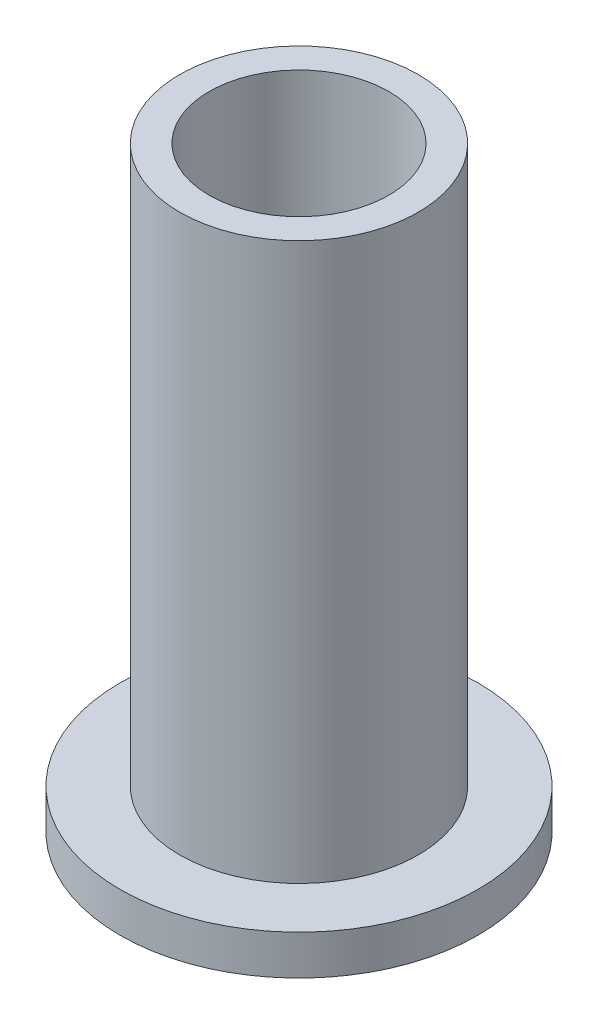
ISO-10303-21;
HEADER;
FILE_DESCRIPTION(('STEP AP214'),'2;1');
FILE_NAME('part.step','',(''),(''),'','','');
FILE_SCHEMA(('AUTOMOTIVE_DESIGN { 1 0 10303 214 1 1 1 1 }'));
ENDSEC;
DATA;
#1=APPLICATION_CONTEXT('core data for automotive mechanical design processes');
#2=APPLICATION_PROTOCOL_DEFINITION('international standard','automotive_design',2000,#1);
#3=PRODUCT_CONTEXT('',#1,'mechanical');
#4=PRODUCT('Part','Part','',(#3));
#5=PRODUCT_RELATED_PRODUCT_CATEGORY('part','',(#4));
#6=PRODUCT_DEFINITION_FORMATION('','',#4);
#7=PRODUCT_DEFINITION_CONTEXT('part definition',#1,'design');
#8=PRODUCT_DEFINITION('design','',#6,#7);
#9=PRODUCT_DEFINITION_SHAPE('','',#8);
#10=(LENGTH_UNIT() NAMED_UNIT(*) SI_UNIT(.MILLI.,.METRE.));
#11=(NAMED_UNIT(*) PLANE_ANGLE_UNIT() SI_UNIT($,.RADIAN.));
#12=(NAMED_UNIT(*) SI_UNIT($,.STERADIAN.) SOLID_ANGLE_UNIT());
#13=UNCERTAINTY_MEASURE_WITH_UNIT(LENGTH_MEASURE(1.E-05),#10,'distance_accuracy_value','');
#14=(GEOMETRIC_REPRESENTATION_CONTEXT(3) GLOBAL_UNCERTAINTY_ASSIGNED_CONTEXT((#13)) GLOBAL_UNIT_ASSIGNED_CONTEXT((#10,
#11,#12)) REPRESENTATION_CONTEXT('',''));
#15=CARTESIAN_POINT('',(0.,0.,0.));
#16=DIRECTION('',(0.,0.,1.));
#17=DIRECTION('',(1.,0.,0.));
#18=AXIS2_PLACEMENT_3D('',#15,#16,#17);
#19=CARTESIAN_POINT('',(0.,30.,1.37085700149123));
#20=DIRECTION('',(0.,-1.,0.));
#21=DIRECTION('',(0.,0.,-1.));
#22=AXIS2_PLACEMENT_3D('',#19,#20,#21);
#23=CYLINDRICAL_SURFACE('',#22,5.99994790325991);
#24=CARTESIAN_POINT('',(0.,30.,1.37085700149123));
#25=DIRECTION('',(0.,1.,0.));
#26=DIRECTION('',(0.,0.,1.));
#27=AXIS2_PLACEMENT_3D('',#24,#25,#26);
#28=CIRCLE('',#27,5.99994790325991);
#29=CARTESIAN_POINT('',(0.,30.,7.37080490475113));
#30=VERTEX_POINT('',#29);
#31=EDGE_CURVE('E37',#30,#30,#28,.T.);
#32=ORIENTED_EDGE('',*,*,#31,.F.);
#33=EDGE_LOOP('',(#32));
#34=FACE_BOUND('',#33,.T.);
#35=CARTESIAN_POINT('',(0.,2.,1.37085700149123));
#36=DIRECTION('',(0.,-1.,0.));
#37=DIRECTION('',(0.,0.,-1.));
#38=AXIS2_PLACEMENT_3D('',#35,#36,#37);
#39=CIRCLE('',#38,5.99994790325991);
#40=CARTESIAN_POINT('',(0.,2.,-4.62909090176868));
#41=VERTEX_POINT('',#40);
#42=EDGE_CURVE('E10',#41,#41,#39,.T.);
#43=ORIENTED_EDGE('',*,*,#42,.F.);
#44=EDGE_LOOP('',(#43));
#45=FACE_BOUND('',#44,.T.);
#46=ADVANCED_FACE('F31',(#34,#45),#23,.T.);
#47=CARTESIAN_POINT('',(0.,30.,1.37085700149123));
#48=DIRECTION('',(0.,1.,0.));
#49=DIRECTION('',(0.,0.,1.));
#50=AXIS2_PLACEMENT_3D('',#47,#48,#49);
#51=PLANE('',#50);
#52=ORIENTED_EDGE('',*,*,#31,.T.);
#53=EDGE_LOOP('',(#52));
#54=FACE_BOUND('',#53,.T.);
#55=CARTESIAN_POINT('',(0.,30.,1.37085700149123));
#56=DIRECTION('',(0.,1.,0.));
#57=DIRECTION('',(0.,0.,1.));
#58=AXIS2_PLACEMENT_3D('',#55,#56,#57);
#59=CIRCLE('',#58,4.52110916376114);
#60=CARTESIAN_POINT('',(0.,30.,5.89196616525237));
#61=VERTEX_POINT('',#60);
#62=EDGE_CURVE('E41',#61,#61,#59,.T.);
#63=ORIENTED_EDGE('',*,*,#62,.F.);
#64=EDGE_LOOP('',(#63));
#65=FACE_BOUND('',#64,.T.);
#66=ADVANCED_FACE('F69',(#54,#65),#51,.T.);
#67=CARTESIAN_POINT('',(0.,0.,1.37085700149123));
#68=DIRECTION('',(0.,1.,0.));
#69=DIRECTION('',(0.,0.,1.));
#70=AXIS2_PLACEMENT_3D('',#67,#68,#69);
#71=PLANE('',#70);
#72=CARTESIAN_POINT('',(0.,0.,1.37085700149123));
#73=DIRECTION('',(0.,1.,0.));
#74=DIRECTION('',(0.,0.,1.));
#75=AXIS2_PLACEMENT_3D('',#72,#73,#74);
#76=CIRCLE('',#75,4.52110916376114);
#77=CARTESIAN_POINT('',(0.,0.,5.89196616525237));
#78=VERTEX_POINT('',#77);
#79=EDGE_CURVE('E45',#78,#78,#76,.T.);
#80=ORIENTED_EDGE('',*,*,#79,.T.);
#81=EDGE_LOOP('',(#80));
#82=FACE_BOUND('',#81,.T.);
#83=CARTESIAN_POINT('',(0.,0.,1.37085700149123));
#84=DIRECTION('',(0.,-1.,0.));
#85=DIRECTION('',(0.,0.,-1.));
#86=AXIS2_PLACEMENT_3D('',#83,#84,#85);
#87=CIRCLE('',#86,8.99994790325991);
#88=CARTESIAN_POINT('',(0.,0.,-7.62909090176868));
#89=VERTEX_POINT('',#88);
#90=EDGE_CURVE('E51',#89,#89,#87,.T.);
#91=ORIENTED_EDGE('',*,*,#90,.T.);
#92=EDGE_LOOP('',(#91));
#93=FACE_BOUND('',#92,.T.);
#94=ADVANCED_FACE('F74',(#82,#93),#71,.F.);
#95=CARTESIAN_POINT('',(0.,30.,1.37085700149123));
#96=DIRECTION('',(0.,-1.,0.));
#97=DIRECTION('',(0.,0.,-1.));
#98=AXIS2_PLACEMENT_3D('',#95,#96,#97);
#99=CYLINDRICAL_SURFACE('',#98,4.52110916376114);
#100=ORIENTED_EDGE('',*,*,#62,.T.);
#101=EDGE_LOOP('',(#100));
#102=FACE_BOUND('',#101,.T.);
#103=ORIENTED_EDGE('',*,*,#79,.F.);
#104=EDGE_LOOP('',(#103));
#105=FACE_BOUND('',#104,.T.);
#106=ADVANCED_FACE('F66',(#102,#105),#99,.F.);
#107=CARTESIAN_POINT('',(0.,2.,1.37085700149123));
#108=DIRECTION('',(0.,-1.,0.));
#109=DIRECTION('',(0.,0.,-1.));
#110=AXIS2_PLACEMENT_3D('',#107,#108,#109);
#111=CYLINDRICAL_SURFACE('',#110,8.99994790325991);
#112=CARTESIAN_POINT('',(0.,2.,1.37085700149123));
#113=DIRECTION('',(0.,-1.,0.));
#114=DIRECTION('',(0.,0.,-1.));
#115=AXIS2_PLACEMENT_3D('',#112,#113,#114);
#116=CIRCLE('',#115,8.99994790325991);
#117=CARTESIAN_POINT('',(0.,2.,-7.62909090176868));
#118=VERTEX_POINT('',#117);
#119=EDGE_CURVE('E49',#118,#118,#116,.T.);
#120=ORIENTED_EDGE('',*,*,#119,.T.);
#121=EDGE_LOOP('',(#120));
#122=FACE_BOUND('',#121,.T.);
#123=ORIENTED_EDGE('',*,*,#90,.F.);
#124=EDGE_LOOP('',(#123));
#125=FACE_BOUND('',#124,.T.);
#126=ADVANCED_FACE('F57',(#122,#125),#111,.T.);
#127=CARTESIAN_POINT('',(0.,2.,1.37085700149123));
#128=DIRECTION('',(0.,-1.,0.));
#129=DIRECTION('',(0.,0.,-1.));
#130=AXIS2_PLACEMENT_3D('',#127,#128,#129);
#131=PLANE('',#130);
#132=ORIENTED_EDGE('',*,*,#42,.T.);
#133=EDGE_LOOP('',(#132));
#134=FACE_BOUND('',#133,.T.);
#135=ORIENTED_EDGE('',*,*,#119,.F.);
#136=EDGE_LOOP('',(#135));
#137=FACE_BOUND('',#136,.T.);
#138=ADVANCED_FACE('F60',(#134,#137),#131,.F.);
#139=CLOSED_SHELL('',(#46,#66,#94,#106,#126,#138));
#140=MANIFOLD_SOLID_BREP('B2',#139);
#141=ADVANCED_BREP_SHAPE_REPRESENTATION('',(#18,#140),#14);
#142=SHAPE_DEFINITION_REPRESENTATION(#9,#141);
ENDSEC;
END-ISO-10303-21;
